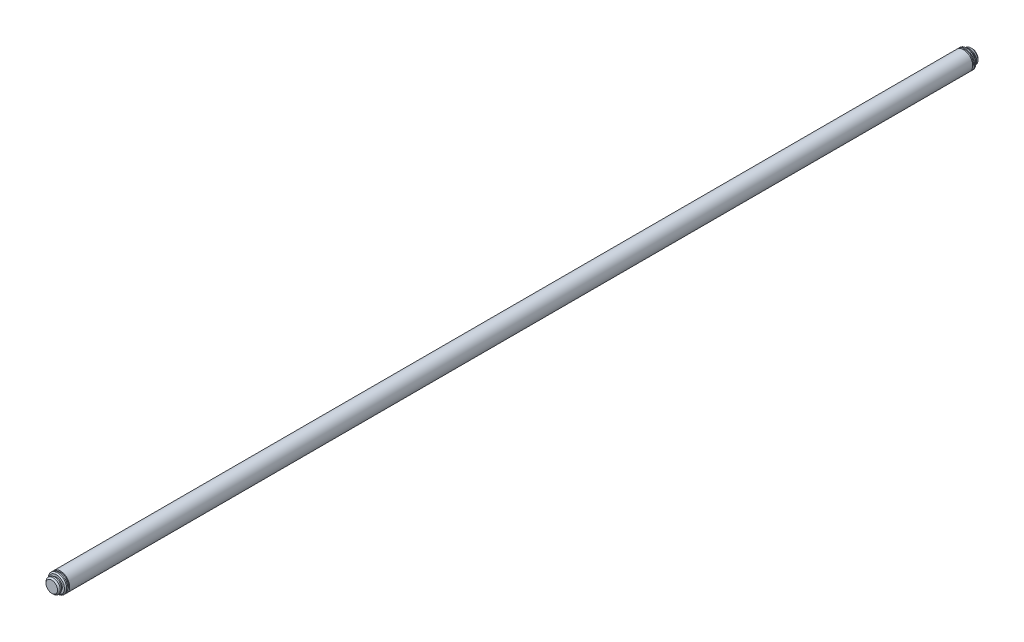
ISO-10303-21;
HEADER;
FILE_DESCRIPTION(('STEP AP214'),'2;1');
FILE_NAME('part.step','',(''),(''),'','','');
FILE_SCHEMA(('AUTOMOTIVE_DESIGN { 1 0 10303 214 1 1 1 1 }'));
ENDSEC;
DATA;
#1=APPLICATION_CONTEXT('core data for automotive mechanical design processes');
#2=APPLICATION_PROTOCOL_DEFINITION('international standard','automotive_design',2000,#1);
#3=PRODUCT_CONTEXT('',#1,'mechanical');
#4=PRODUCT('Part','Part','',(#3));
#5=PRODUCT_RELATED_PRODUCT_CATEGORY('part','',(#4));
#6=PRODUCT_DEFINITION_FORMATION('','',#4);
#7=PRODUCT_DEFINITION_CONTEXT('part definition',#1,'design');
#8=PRODUCT_DEFINITION('design','',#6,#7);
#9=PRODUCT_DEFINITION_SHAPE('','',#8);
#10=(LENGTH_UNIT() NAMED_UNIT(*) SI_UNIT(.MILLI.,.METRE.));
#11=(NAMED_UNIT(*) PLANE_ANGLE_UNIT() SI_UNIT($,.RADIAN.));
#12=(NAMED_UNIT(*) SI_UNIT($,.STERADIAN.) SOLID_ANGLE_UNIT());
#13=UNCERTAINTY_MEASURE_WITH_UNIT(LENGTH_MEASURE(1.E-05),#10,'distance_accuracy_value','');
#14=(GEOMETRIC_REPRESENTATION_CONTEXT(3) GLOBAL_UNCERTAINTY_ASSIGNED_CONTEXT((#13)) GLOBAL_UNIT_ASSIGNED_CONTEXT((#10,
#11,#12)) REPRESENTATION_CONTEXT('',''));
#15=CARTESIAN_POINT('',(0.,0.,0.));
#16=DIRECTION('',(0.,0.,1.));
#17=DIRECTION('',(1.,0.,0.));
#18=AXIS2_PLACEMENT_3D('',#15,#16,#17);
#19=CARTESIAN_POINT('',(0.,0.,-400.));
#20=DIRECTION('',(0.,0.,1.));
#21=DIRECTION('',(1.,0.,0.));
#22=AXIS2_PLACEMENT_3D('',#19,#20,#21);
#23=PLANE('',#22);
#24=CARTESIAN_POINT('',(0.,0.,-400.));
#25=DIRECTION('',(0.,0.,1.));
#26=DIRECTION('',(1.,0.,0.));
#27=AXIS2_PLACEMENT_3D('',#24,#25,#26);
#28=CIRCLE('',#27,2.50000000000003);
#29=CARTESIAN_POINT('',(2.50000000000003,0.,-400.));
#30=VERTEX_POINT('',#29);
#31=EDGE_CURVE('E10',#30,#30,#28,.T.);
#32=ORIENTED_EDGE('',*,*,#31,.F.);
#33=EDGE_LOOP('',(#32));
#34=FACE_BOUND('',#33,.T.);
#35=ADVANCED_FACE('F43',(#34),#23,.F.);
#36=CARTESIAN_POINT('',(0.,0.,-399.4));
#37=DIRECTION('',(0.,0.,1.));
#38=DIRECTION('',(1.,0.,0.));
#39=AXIS2_PLACEMENT_3D('',#36,#37,#38);
#40=CONICAL_SURFACE('',#39,3.09999999999994,0.785398163397425);
#41=ORIENTED_EDGE('',*,*,#31,.T.);
#42=EDGE_LOOP('',(#41));
#43=FACE_BOUND('',#42,.T.);
#44=CARTESIAN_POINT('',(0.,0.,-399.4));
#45=DIRECTION('',(0.,0.,1.));
#46=DIRECTION('',(1.,0.,0.));
#47=AXIS2_PLACEMENT_3D('',#44,#45,#46);
#48=CIRCLE('',#47,3.09999999999994);
#49=CARTESIAN_POINT('',(3.09999999999994,0.,-399.4));
#50=VERTEX_POINT('',#49);
#51=EDGE_CURVE('E49',#50,#50,#48,.T.);
#52=ORIENTED_EDGE('',*,*,#51,.F.);
#53=EDGE_LOOP('',(#52));
#54=FACE_BOUND('',#53,.T.);
#55=ADVANCED_FACE('F143',(#43,#54),#40,.T.);
#56=CARTESIAN_POINT('',(0.,0.,0.));
#57=DIRECTION('',(0.,0.,1.));
#58=DIRECTION('',(1.,0.,0.));
#59=AXIS2_PLACEMENT_3D('',#56,#57,#58);
#60=CYLINDRICAL_SURFACE('',#59,3.09999999999997);
#61=ORIENTED_EDGE('',*,*,#51,.T.);
#62=EDGE_LOOP('',(#61));
#63=FACE_BOUND('',#62,.T.);
#64=CARTESIAN_POINT('',(0.,0.,-398.8));
#65=DIRECTION('',(0.,0.,1.));
#66=DIRECTION('',(1.,0.,0.));
#67=AXIS2_PLACEMENT_3D('',#64,#65,#66);
#68=CIRCLE('',#67,3.1);
#69=CARTESIAN_POINT('',(3.1,0.,-398.8));
#70=VERTEX_POINT('',#69);
#71=EDGE_CURVE('E53',#70,#70,#68,.T.);
#72=ORIENTED_EDGE('',*,*,#71,.F.);
#73=EDGE_LOOP('',(#72));
#74=FACE_BOUND('',#73,.T.);
#75=ADVANCED_FACE('F148',(#63,#74),#60,.T.);
#76=CARTESIAN_POINT('',(0.,0.,-398.8));
#77=DIRECTION('',(0.,0.,-1.));
#78=DIRECTION('',(-1.,0.,0.));
#79=AXIS2_PLACEMENT_3D('',#76,#77,#78);
#80=PLANE('',#79);
#81=CARTESIAN_POINT('',(0.,0.,-398.8));
#82=DIRECTION('',(0.,0.,1.));
#83=DIRECTION('',(1.,0.,0.));
#84=AXIS2_PLACEMENT_3D('',#81,#82,#83);
#85=CIRCLE('',#84,2.6);
#86=CARTESIAN_POINT('',(2.6,0.,-398.8));
#87=VERTEX_POINT('',#86);
#88=EDGE_CURVE('E57',#87,#87,#85,.T.);
#89=ORIENTED_EDGE('',*,*,#88,.F.);
#90=EDGE_LOOP('',(#89));
#91=FACE_BOUND('',#90,.T.);
#92=ORIENTED_EDGE('',*,*,#71,.T.);
#93=EDGE_LOOP('',(#92));
#94=FACE_BOUND('',#93,.T.);
#95=ADVANCED_FACE('F152',(#91,#94),#80,.F.);
#96=CARTESIAN_POINT('',(0.,0.,0.));
#97=DIRECTION('',(0.,0.,1.));
#98=DIRECTION('',(1.,0.,0.));
#99=AXIS2_PLACEMENT_3D('',#96,#97,#98);
#100=CYLINDRICAL_SURFACE('',#99,2.6);
#101=ORIENTED_EDGE('',*,*,#88,.T.);
#102=EDGE_LOOP('',(#101));
#103=FACE_BOUND('',#102,.T.);
#104=CARTESIAN_POINT('',(0.,0.,-398.));
#105=DIRECTION('',(0.,0.,1.));
#106=DIRECTION('',(1.,0.,0.));
#107=AXIS2_PLACEMENT_3D('',#104,#105,#106);
#108=CIRCLE('',#107,2.6);
#109=CARTESIAN_POINT('',(2.6,0.,-398.));
#110=VERTEX_POINT('',#109);
#111=EDGE_CURVE('E62',#110,#110,#108,.T.);
#112=ORIENTED_EDGE('',*,*,#111,.F.);
#113=EDGE_LOOP('',(#112));
#114=FACE_BOUND('',#113,.T.);
#115=ADVANCED_FACE('F158',(#103,#114),#100,.T.);
#116=CARTESIAN_POINT('',(0.,0.,-398.));
#117=DIRECTION('',(0.,0.,1.));
#118=DIRECTION('',(1.,0.,0.));
#119=AXIS2_PLACEMENT_3D('',#116,#117,#118);
#120=PLANE('',#119);
#121=CARTESIAN_POINT('',(0.,0.,-398.));
#122=DIRECTION('',(0.,0.,1.));
#123=DIRECTION('',(1.,0.,0.));
#124=AXIS2_PLACEMENT_3D('',#121,#122,#123);
#125=CIRCLE('',#124,3.50000000000001);
#126=CARTESIAN_POINT('',(3.50000000000001,0.,-398.));
#127=VERTEX_POINT('',#126);
#128=EDGE_CURVE('E65',#127,#127,#125,.T.);
#129=ORIENTED_EDGE('',*,*,#128,.F.);
#130=EDGE_LOOP('',(#129));
#131=FACE_BOUND('',#130,.T.);
#132=ORIENTED_EDGE('',*,*,#111,.T.);
#133=EDGE_LOOP('',(#132));
#134=FACE_BOUND('',#133,.T.);
#135=ADVANCED_FACE('F162',(#131,#134),#120,.F.);
#136=CARTESIAN_POINT('',(0.,0.,-397.5));
#137=DIRECTION('',(0.,0.,1.));
#138=DIRECTION('',(1.,0.,0.));
#139=AXIS2_PLACEMENT_3D('',#136,#137,#138);
#140=CONICAL_SURFACE('',#139,3.99999999999995,0.785398163397443);
#141=ORIENTED_EDGE('',*,*,#128,.T.);
#142=EDGE_LOOP('',(#141));
#143=FACE_BOUND('',#142,.T.);
#144=CARTESIAN_POINT('',(0.,0.,-397.5));
#145=DIRECTION('',(0.,0.,1.));
#146=DIRECTION('',(1.,0.,0.));
#147=AXIS2_PLACEMENT_3D('',#144,#145,#146);
#148=CIRCLE('',#147,3.99999999999995);
#149=CARTESIAN_POINT('',(3.99999999999995,0.,-397.5));
#150=VERTEX_POINT('',#149);
#151=EDGE_CURVE('E68',#150,#150,#148,.T.);
#152=ORIENTED_EDGE('',*,*,#151,.F.);
#153=EDGE_LOOP('',(#152));
#154=FACE_BOUND('',#153,.T.);
#155=ADVANCED_FACE('F166',(#143,#154),#140,.T.);
#156=CARTESIAN_POINT('',(0.,0.,0.));
#157=DIRECTION('',(0.,0.,1.));
#158=DIRECTION('',(1.,0.,0.));
#159=AXIS2_PLACEMENT_3D('',#156,#157,#158);
#160=CYLINDRICAL_SURFACE('',#159,3.99999999999997);
#161=CARTESIAN_POINT('',(0.,0.,-397.));
#162=DIRECTION('',(0.,0.,1.));
#163=DIRECTION('',(1.,0.,0.));
#164=AXIS2_PLACEMENT_3D('',#161,#162,#163);
#165=CIRCLE('',#164,4.);
#166=CARTESIAN_POINT('',(4.,0.,-397.));
#167=VERTEX_POINT('',#166);
#168=EDGE_CURVE('E71',#167,#167,#165,.T.);
#169=ORIENTED_EDGE('',*,*,#168,.F.);
#170=EDGE_LOOP('',(#169));
#171=FACE_BOUND('',#170,.T.);
#172=ORIENTED_EDGE('',*,*,#151,.T.);
#173=EDGE_LOOP('',(#172));
#174=FACE_BOUND('',#173,.T.);
#175=ADVANCED_FACE('F170',(#171,#174),#160,.T.);
#176=CARTESIAN_POINT('',(0.,0.,-397.));
#177=DIRECTION('',(0.,0.,1.));
#178=DIRECTION('',(1.,0.,0.));
#179=AXIS2_PLACEMENT_3D('',#176,#177,#178);
#180=PLANE('',#179);
#181=ORIENTED_EDGE('',*,*,#168,.T.);
#182=EDGE_LOOP('',(#181));
#183=FACE_BOUND('',#182,.T.);
#184=CARTESIAN_POINT('',(0.,0.,-397.));
#185=DIRECTION('',(0.,0.,1.));
#186=DIRECTION('',(1.,0.,0.));
#187=AXIS2_PLACEMENT_3D('',#184,#185,#186);
#188=CIRCLE('',#187,3.5);
#189=CARTESIAN_POINT('',(3.5,0.,-397.));
#190=VERTEX_POINT('',#189);
#191=EDGE_CURVE('E74',#190,#190,#188,.T.);
#192=ORIENTED_EDGE('',*,*,#191,.F.);
#193=EDGE_LOOP('',(#192));
#194=FACE_BOUND('',#193,.T.);
#195=ADVANCED_FACE('F174',(#183,#194),#180,.T.);
#196=CARTESIAN_POINT('',(0.,0.,0.));
#197=DIRECTION('',(0.,0.,1.));
#198=DIRECTION('',(1.,0.,0.));
#199=AXIS2_PLACEMENT_3D('',#196,#197,#198);
#200=CYLINDRICAL_SURFACE('',#199,3.5);
#201=CARTESIAN_POINT('',(0.,0.,-396.2));
#202=DIRECTION('',(0.,0.,1.));
#203=DIRECTION('',(1.,0.,0.));
#204=AXIS2_PLACEMENT_3D('',#201,#202,#203);
#205=CIRCLE('',#204,3.5);
#206=CARTESIAN_POINT('',(3.5,0.,-396.2));
#207=VERTEX_POINT('',#206);
#208=EDGE_CURVE('E77',#207,#207,#205,.T.);
#209=ORIENTED_EDGE('',*,*,#208,.F.);
#210=EDGE_LOOP('',(#209));
#211=FACE_BOUND('',#210,.T.);
#212=ORIENTED_EDGE('',*,*,#191,.T.);
#213=EDGE_LOOP('',(#212));
#214=FACE_BOUND('',#213,.T.);
#215=ADVANCED_FACE('F178',(#211,#214),#200,.T.);
#216=CARTESIAN_POINT('',(0.,0.,-396.2));
#217=DIRECTION('',(0.,0.,-1.));
#218=DIRECTION('',(-1.,0.,0.));
#219=AXIS2_PLACEMENT_3D('',#216,#217,#218);
#220=PLANE('',#219);
#221=ORIENTED_EDGE('',*,*,#208,.T.);
#222=EDGE_LOOP('',(#221));
#223=FACE_BOUND('',#222,.T.);
#224=CARTESIAN_POINT('',(0.,0.,-396.2));
#225=DIRECTION('',(0.,0.,1.));
#226=DIRECTION('',(1.,0.,0.));
#227=AXIS2_PLACEMENT_3D('',#224,#225,#226);
#228=CIRCLE('',#227,4.);
#229=CARTESIAN_POINT('',(4.,0.,-396.2));
#230=VERTEX_POINT('',#229);
#231=EDGE_CURVE('E80',#230,#230,#228,.T.);
#232=ORIENTED_EDGE('',*,*,#231,.F.);
#233=EDGE_LOOP('',(#232));
#234=FACE_BOUND('',#233,.T.);
#235=ADVANCED_FACE('F182',(#223,#234),#220,.T.);
#236=CARTESIAN_POINT('',(0.,0.,0.));
#237=DIRECTION('',(0.,0.,1.));
#238=DIRECTION('',(1.,0.,0.));
#239=AXIS2_PLACEMENT_3D('',#236,#237,#238);
#240=CYLINDRICAL_SURFACE('',#239,4.);
#241=ORIENTED_EDGE('',*,*,#231,.T.);
#242=EDGE_LOOP('',(#241));
#243=FACE_BOUND('',#242,.T.);
#244=CARTESIAN_POINT('',(0.,0.,-3.8));
#245=DIRECTION('',(0.,0.,1.));
#246=DIRECTION('',(1.,0.,0.));
#247=AXIS2_PLACEMENT_3D('',#244,#245,#246);
#248=CIRCLE('',#247,4.);
#249=CARTESIAN_POINT('',(4.,0.,-3.8));
#250=VERTEX_POINT('',#249);
#251=EDGE_CURVE('E83',#250,#250,#248,.T.);
#252=ORIENTED_EDGE('',*,*,#251,.F.);
#253=EDGE_LOOP('',(#252));
#254=FACE_BOUND('',#253,.T.);
#255=ADVANCED_FACE('F186',(#243,#254),#240,.T.);
#256=CARTESIAN_POINT('',(0.,0.,-3.8));
#257=DIRECTION('',(0.,0.,-1.));
#258=DIRECTION('',(-1.,0.,0.));
#259=AXIS2_PLACEMENT_3D('',#256,#257,#258);
#260=PLANE('',#259);
#261=CARTESIAN_POINT('',(0.,0.,-3.8));
#262=DIRECTION('',(0.,0.,1.));
#263=DIRECTION('',(1.,0.,0.));
#264=AXIS2_PLACEMENT_3D('',#261,#262,#263);
#265=CIRCLE('',#264,3.5);
#266=CARTESIAN_POINT('',(3.5,0.,-3.8));
#267=VERTEX_POINT('',#266);
#268=EDGE_CURVE('E86',#267,#267,#265,.T.);
#269=ORIENTED_EDGE('',*,*,#268,.F.);
#270=EDGE_LOOP('',(#269));
#271=FACE_BOUND('',#270,.T.);
#272=ORIENTED_EDGE('',*,*,#251,.T.);
#273=EDGE_LOOP('',(#272));
#274=FACE_BOUND('',#273,.T.);
#275=ADVANCED_FACE('F190',(#271,#274),#260,.F.);
#276=CARTESIAN_POINT('',(0.,0.,0.));
#277=DIRECTION('',(0.,0.,1.));
#278=DIRECTION('',(1.,0.,0.));
#279=AXIS2_PLACEMENT_3D('',#276,#277,#278);
#280=CYLINDRICAL_SURFACE('',#279,3.5);
#281=ORIENTED_EDGE('',*,*,#268,.T.);
#282=EDGE_LOOP('',(#281));
#283=FACE_BOUND('',#282,.T.);
#284=CARTESIAN_POINT('',(0.,0.,-3.));
#285=DIRECTION('',(0.,0.,1.));
#286=DIRECTION('',(1.,0.,0.));
#287=AXIS2_PLACEMENT_3D('',#284,#285,#286);
#288=CIRCLE('',#287,3.5);
#289=CARTESIAN_POINT('',(3.5,0.,-3.));
#290=VERTEX_POINT('',#289);
#291=EDGE_CURVE('E89',#290,#290,#288,.T.);
#292=ORIENTED_EDGE('',*,*,#291,.F.);
#293=EDGE_LOOP('',(#292));
#294=FACE_BOUND('',#293,.T.);
#295=ADVANCED_FACE('F194',(#283,#294),#280,.T.);
#296=CARTESIAN_POINT('',(0.,0.,-3.));
#297=DIRECTION('',(0.,0.,1.));
#298=DIRECTION('',(1.,0.,0.));
#299=AXIS2_PLACEMENT_3D('',#296,#297,#298);
#300=PLANE('',#299);
#301=CARTESIAN_POINT('',(0.,0.,-3.));
#302=DIRECTION('',(0.,0.,1.));
#303=DIRECTION('',(1.,0.,0.));
#304=AXIS2_PLACEMENT_3D('',#301,#302,#303);
#305=CIRCLE('',#304,4.);
#306=CARTESIAN_POINT('',(4.,0.,-3.));
#307=VERTEX_POINT('',#306);
#308=EDGE_CURVE('E92',#307,#307,#305,.T.);
#309=ORIENTED_EDGE('',*,*,#308,.F.);
#310=EDGE_LOOP('',(#309));
#311=FACE_BOUND('',#310,.T.);
#312=ORIENTED_EDGE('',*,*,#291,.T.);
#313=EDGE_LOOP('',(#312));
#314=FACE_BOUND('',#313,.T.);
#315=ADVANCED_FACE('F198',(#311,#314),#300,.F.);
#316=CARTESIAN_POINT('',(0.,0.,0.));
#317=DIRECTION('',(0.,0.,1.));
#318=DIRECTION('',(1.,0.,0.));
#319=AXIS2_PLACEMENT_3D('',#316,#317,#318);
#320=CYLINDRICAL_SURFACE('',#319,4.);
#321=ORIENTED_EDGE('',*,*,#308,.T.);
#322=EDGE_LOOP('',(#321));
#323=FACE_BOUND('',#322,.T.);
#324=CARTESIAN_POINT('',(0.,0.,-2.5));
#325=DIRECTION('',(0.,0.,1.));
#326=DIRECTION('',(1.,0.,0.));
#327=AXIS2_PLACEMENT_3D('',#324,#325,#326);
#328=CIRCLE('',#327,4.);
#329=CARTESIAN_POINT('',(4.,0.,-2.5));
#330=VERTEX_POINT('',#329);
#331=EDGE_CURVE('E95',#330,#330,#328,.T.);
#332=ORIENTED_EDGE('',*,*,#331,.F.);
#333=EDGE_LOOP('',(#332));
#334=FACE_BOUND('',#333,.T.);
#335=ADVANCED_FACE('F202',(#323,#334),#320,.T.);
#336=CARTESIAN_POINT('',(0.,0.,-2.5));
#337=DIRECTION('',(0.,0.,-1.));
#338=DIRECTION('',(-1.,0.,0.));
#339=AXIS2_PLACEMENT_3D('',#336,#337,#338);
#340=CONICAL_SURFACE('',#339,4.,0.785398163397444);
#341=CARTESIAN_POINT('',(0.,0.,-2.));
#342=DIRECTION('',(0.,0.,1.));
#343=DIRECTION('',(1.,0.,0.));
#344=AXIS2_PLACEMENT_3D('',#341,#342,#343);
#345=CIRCLE('',#344,3.50000000000001);
#346=CARTESIAN_POINT('',(3.50000000000001,0.,-2.));
#347=VERTEX_POINT('',#346);
#348=EDGE_CURVE('E98',#347,#347,#345,.T.);
#349=ORIENTED_EDGE('',*,*,#348,.F.);
#350=EDGE_LOOP('',(#349));
#351=FACE_BOUND('',#350,.T.);
#352=ORIENTED_EDGE('',*,*,#331,.T.);
#353=EDGE_LOOP('',(#352));
#354=FACE_BOUND('',#353,.T.);
#355=ADVANCED_FACE('F206',(#351,#354),#340,.T.);
#356=CARTESIAN_POINT('',(0.,0.,-2.));
#357=DIRECTION('',(0.,0.,1.));
#358=DIRECTION('',(1.,0.,0.));
#359=AXIS2_PLACEMENT_3D('',#356,#357,#358);
#360=PLANE('',#359);
#361=ORIENTED_EDGE('',*,*,#348,.T.);
#362=EDGE_LOOP('',(#361));
#363=FACE_BOUND('',#362,.T.);
#364=CARTESIAN_POINT('',(0.,0.,-1.99999999999999));
#365=DIRECTION('',(0.,0.,1.));
#366=DIRECTION('',(1.,0.,0.));
#367=AXIS2_PLACEMENT_3D('',#364,#365,#366);
#368=CIRCLE('',#367,2.6);
#369=CARTESIAN_POINT('',(2.6,0.,-1.99999999999999));
#370=VERTEX_POINT('',#369);
#371=EDGE_CURVE('E101',#370,#370,#368,.T.);
#372=ORIENTED_EDGE('',*,*,#371,.F.);
#373=EDGE_LOOP('',(#372));
#374=FACE_BOUND('',#373,.T.);
#375=ADVANCED_FACE('F139',(#363,#374),#360,.T.);
#376=CARTESIAN_POINT('',(0.,0.,0.));
#377=DIRECTION('',(0.,0.,1.));
#378=DIRECTION('',(1.,0.,0.));
#379=AXIS2_PLACEMENT_3D('',#376,#377,#378);
#380=CYLINDRICAL_SURFACE('',#379,2.6);
#381=CARTESIAN_POINT('',(0.,0.,-1.2));
#382=DIRECTION('',(0.,0.,1.));
#383=DIRECTION('',(1.,0.,0.));
#384=AXIS2_PLACEMENT_3D('',#381,#382,#383);
#385=CIRCLE('',#384,2.6);
#386=CARTESIAN_POINT('',(2.6,0.,-1.2));
#387=VERTEX_POINT('',#386);
#388=EDGE_CURVE('E104',#387,#387,#385,.T.);
#389=ORIENTED_EDGE('',*,*,#388,.F.);
#390=EDGE_LOOP('',(#389));
#391=FACE_BOUND('',#390,.T.);
#392=ORIENTED_EDGE('',*,*,#371,.T.);
#393=EDGE_LOOP('',(#392));
#394=FACE_BOUND('',#393,.T.);
#395=ADVANCED_FACE('F133',(#391,#394),#380,.T.);
#396=CARTESIAN_POINT('',(0.,0.,-1.2));
#397=DIRECTION('',(0.,0.,-1.));
#398=DIRECTION('',(-1.,0.,0.));
#399=AXIS2_PLACEMENT_3D('',#396,#397,#398);
#400=PLANE('',#399);
#401=ORIENTED_EDGE('',*,*,#388,.T.);
#402=EDGE_LOOP('',(#401));
#403=FACE_BOUND('',#402,.T.);
#404=CARTESIAN_POINT('',(0.,0.,-1.2));
#405=DIRECTION('',(0.,0.,1.));
#406=DIRECTION('',(1.,0.,0.));
#407=AXIS2_PLACEMENT_3D('',#404,#405,#406);
#408=CIRCLE('',#407,3.1);
#409=CARTESIAN_POINT('',(3.1,0.,-1.2));
#410=VERTEX_POINT('',#409);
#411=EDGE_CURVE('E107',#410,#410,#408,.T.);
#412=ORIENTED_EDGE('',*,*,#411,.F.);
#413=EDGE_LOOP('',(#412));
#414=FACE_BOUND('',#413,.T.);
#415=ADVANCED_FACE('F128',(#403,#414),#400,.T.);
#416=CARTESIAN_POINT('',(0.,0.,0.));
#417=DIRECTION('',(0.,0.,1.));
#418=DIRECTION('',(1.,0.,0.));
#419=AXIS2_PLACEMENT_3D('',#416,#417,#418);
#420=CYLINDRICAL_SURFACE('',#419,3.1);
#421=CARTESIAN_POINT('',(0.,0.,-0.600000000000004));
#422=DIRECTION('',(0.,0.,1.));
#423=DIRECTION('',(1.,0.,0.));
#424=AXIS2_PLACEMENT_3D('',#421,#422,#423);
#425=CIRCLE('',#424,3.1);
#426=CARTESIAN_POINT('',(3.1,0.,-0.600000000000004));
#427=VERTEX_POINT('',#426);
#428=EDGE_CURVE('E110',#427,#427,#425,.T.);
#429=ORIENTED_EDGE('',*,*,#428,.F.);
#430=EDGE_LOOP('',(#429));
#431=FACE_BOUND('',#430,.T.);
#432=ORIENTED_EDGE('',*,*,#411,.T.);
#433=EDGE_LOOP('',(#432));
#434=FACE_BOUND('',#433,.T.);
#435=ADVANCED_FACE('F122',(#431,#434),#420,.T.);
#436=CARTESIAN_POINT('',(0.,0.,-0.600000000000004));
#437=DIRECTION('',(0.,0.,-1.));
#438=DIRECTION('',(-1.,0.,0.));
#439=AXIS2_PLACEMENT_3D('',#436,#437,#438);
#440=CONICAL_SURFACE('',#439,3.1,0.78539816339745);
#441=CARTESIAN_POINT('',(0.,0.,0.));
#442=DIRECTION('',(0.,0.,1.));
#443=DIRECTION('',(1.,0.,0.));
#444=AXIS2_PLACEMENT_3D('',#441,#442,#443);
#445=CIRCLE('',#444,2.49999999999999);
#446=CARTESIAN_POINT('',(2.49999999999999,0.,0.));
#447=VERTEX_POINT('',#446);
#448=EDGE_CURVE('E113',#447,#447,#445,.T.);
#449=ORIENTED_EDGE('',*,*,#448,.F.);
#450=EDGE_LOOP('',(#449));
#451=FACE_BOUND('',#450,.T.);
#452=ORIENTED_EDGE('',*,*,#428,.T.);
#453=EDGE_LOOP('',(#452));
#454=FACE_BOUND('',#453,.T.);
#455=ADVANCED_FACE('F119',(#451,#454),#440,.T.);
#456=CARTESIAN_POINT('',(0.,0.,0.));
#457=DIRECTION('',(0.,0.,1.));
#458=DIRECTION('',(1.,0.,0.));
#459=AXIS2_PLACEMENT_3D('',#456,#457,#458);
#460=PLANE('',#459);
#461=ORIENTED_EDGE('',*,*,#448,.T.);
#462=EDGE_LOOP('',(#461));
#463=FACE_BOUND('',#462,.T.);
#464=ADVANCED_FACE('F117',(#463),#460,.T.);
#465=CLOSED_SHELL('',(#35,#55,#75,#95,#115,#135,#155,#175,#195,#215,#235,#255,#275,#295,#315,
#335,#355,#375,#395,#415,#435,#455,#464));
#466=MANIFOLD_SOLID_BREP('B2',#465);
#467=ADVANCED_BREP_SHAPE_REPRESENTATION('',(#18,#466),#14);
#468=SHAPE_DEFINITION_REPRESENTATION(#9,#467);
ENDSEC;
END-ISO-10303-21;
